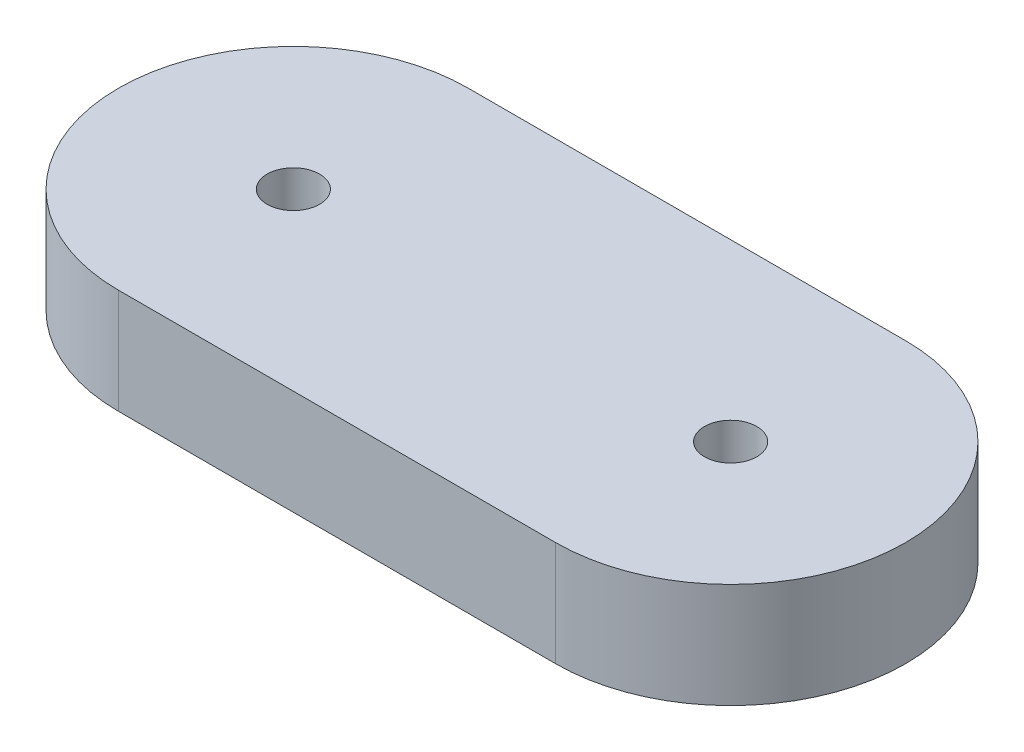
ISO-10303-21;
HEADER;
FILE_DESCRIPTION(('STEP AP214'),'2;1');
FILE_NAME('part.step','',(''),(''),'','','');
FILE_SCHEMA(('AUTOMOTIVE_DESIGN { 1 0 10303 214 1 1 1 1 }'));
ENDSEC;
DATA;
#1=APPLICATION_CONTEXT('core data for automotive mechanical design processes');
#2=APPLICATION_PROTOCOL_DEFINITION('international standard','automotive_design',2000,#1);
#3=PRODUCT_CONTEXT('',#1,'mechanical');
#4=PRODUCT('Part','Part','',(#3));
#5=PRODUCT_RELATED_PRODUCT_CATEGORY('part','',(#4));
#6=PRODUCT_DEFINITION_FORMATION('','',#4);
#7=PRODUCT_DEFINITION_CONTEXT('part definition',#1,'design');
#8=PRODUCT_DEFINITION('design','',#6,#7);
#9=PRODUCT_DEFINITION_SHAPE('','',#8);
#10=(LENGTH_UNIT() NAMED_UNIT(*) SI_UNIT(.MILLI.,.METRE.));
#11=(NAMED_UNIT(*) PLANE_ANGLE_UNIT() SI_UNIT($,.RADIAN.));
#12=(NAMED_UNIT(*) SI_UNIT($,.STERADIAN.) SOLID_ANGLE_UNIT());
#13=UNCERTAINTY_MEASURE_WITH_UNIT(LENGTH_MEASURE(1.E-05),#10,'distance_accuracy_value','');
#14=(GEOMETRIC_REPRESENTATION_CONTEXT(3) GLOBAL_UNCERTAINTY_ASSIGNED_CONTEXT((#13)) GLOBAL_UNIT_ASSIGNED_CONTEXT((#10,
#11,#12)) REPRESENTATION_CONTEXT('',''));
#15=CARTESIAN_POINT('',(0.,0.,0.));
#16=DIRECTION('',(0.,0.,1.));
#17=DIRECTION('',(1.,0.,0.));
#18=AXIS2_PLACEMENT_3D('',#15,#16,#17);
#19=CARTESIAN_POINT('',(-12.5,6.,0.));
#20=DIRECTION('',(0.,1.,0.));
#21=DIRECTION('',(0.,0.,1.));
#22=AXIS2_PLACEMENT_3D('',#19,#20,#21);
#23=PLANE('',#22);
#24=CARTESIAN_POINT('',(-12.5,6.,0.));
#25=DIRECTION('',(0.,1.,0.));
#26=DIRECTION('',(0.,0.,1.));
#27=AXIS2_PLACEMENT_3D('',#24,#25,#26);
#28=CIRCLE('',#27,10.);
#29=CARTESIAN_POINT('',(-12.5,6.,-10.));
#30=VERTEX_POINT('',#29);
#31=CARTESIAN_POINT('',(-12.5,6.,10.));
#32=VERTEX_POINT('',#31);
#33=EDGE_CURVE('E109',#30,#32,#28,.T.);
#34=ORIENTED_EDGE('',*,*,#33,.T.);
#35=DIRECTION('',(1.,0.,0.));
#36=VECTOR('',#35,1.);
#37=CARTESIAN_POINT('',(-12.5,6.,10.));
#38=LINE('',#37,#36);
#39=CARTESIAN_POINT('',(12.5,6.,9.99999999999999));
#40=VERTEX_POINT('',#39);
#41=EDGE_CURVE('E66',#32,#40,#38,.T.);
#42=ORIENTED_EDGE('',*,*,#41,.T.);
#43=CARTESIAN_POINT('',(12.5,6.,0.));
#44=DIRECTION('',(0.,-1.,0.));
#45=DIRECTION('',(0.,0.,1.));
#46=AXIS2_PLACEMENT_3D('',#43,#44,#45);
#47=CIRCLE('',#46,10.);
#48=CARTESIAN_POINT('',(12.5,6.,-10.));
#49=VERTEX_POINT('',#48);
#50=EDGE_CURVE('E88',#49,#40,#47,.T.);
#51=ORIENTED_EDGE('',*,*,#50,.F.);
#52=DIRECTION('',(-1.,0.,0.));
#53=VECTOR('',#52,1.);
#54=CARTESIAN_POINT('',(-12.5,6.,-10.));
#55=LINE('',#54,#53);
#56=EDGE_CURVE('E49',#49,#30,#55,.T.);
#57=ORIENTED_EDGE('',*,*,#56,.T.);
#58=EDGE_LOOP('',(#34,#42,#51,#57));
#59=FACE_BOUND('',#58,.T.);
#60=CARTESIAN_POINT('',(-12.5,6.,0.));
#61=DIRECTION('',(0.,1.,0.));
#62=DIRECTION('',(0.,0.,1.));
#63=AXIS2_PLACEMENT_3D('',#60,#61,#62);
#64=CIRCLE('',#63,1.5);
#65=CARTESIAN_POINT('',(-12.5,6.,1.5));
#66=VERTEX_POINT('',#65);
#67=EDGE_CURVE('E104',#66,#66,#64,.T.);
#68=ORIENTED_EDGE('',*,*,#67,.F.);
#69=EDGE_LOOP('',(#68));
#70=FACE_BOUND('',#69,.T.);
#71=CARTESIAN_POINT('',(12.5,6.,0.));
#72=DIRECTION('',(0.,-1.,0.));
#73=DIRECTION('',(0.,0.,1.));
#74=AXIS2_PLACEMENT_3D('',#71,#72,#73);
#75=CIRCLE('',#74,1.5);
#76=CARTESIAN_POINT('',(12.5,6.,1.5));
#77=VERTEX_POINT('',#76);
#78=EDGE_CURVE('E94',#77,#77,#75,.T.);
#79=ORIENTED_EDGE('',*,*,#78,.T.);
#80=EDGE_LOOP('',(#79));
#81=FACE_BOUND('',#80,.T.);
#82=ADVANCED_FACE('F32',(#59,#70,#81),#23,.T.);
#83=CARTESIAN_POINT('',(-12.5,0.,0.));
#84=DIRECTION('',(0.,1.,0.));
#85=DIRECTION('',(0.,0.,1.));
#86=AXIS2_PLACEMENT_3D('',#83,#84,#85);
#87=PLANE('',#86);
#88=CARTESIAN_POINT('',(-12.5,0.,0.));
#89=DIRECTION('',(0.,1.,0.));
#90=DIRECTION('',(0.,0.,1.));
#91=AXIS2_PLACEMENT_3D('',#88,#89,#90);
#92=CIRCLE('',#91,10.);
#93=CARTESIAN_POINT('',(-12.5,0.,-10.));
#94=VERTEX_POINT('',#93);
#95=CARTESIAN_POINT('',(-12.5,0.,10.));
#96=VERTEX_POINT('',#95);
#97=EDGE_CURVE('E81',#94,#96,#92,.T.);
#98=ORIENTED_EDGE('',*,*,#97,.F.);
#99=DIRECTION('',(-1.,0.,0.));
#100=VECTOR('',#99,1.);
#101=CARTESIAN_POINT('',(-12.5,0.,-10.));
#102=LINE('',#101,#100);
#103=CARTESIAN_POINT('',(12.5,0.,-10.));
#104=VERTEX_POINT('',#103);
#105=EDGE_CURVE('E80',#104,#94,#102,.T.);
#106=ORIENTED_EDGE('',*,*,#105,.F.);
#107=CARTESIAN_POINT('',(12.5,0.,0.));
#108=DIRECTION('',(0.,-1.,0.));
#109=DIRECTION('',(0.,0.,1.));
#110=AXIS2_PLACEMENT_3D('',#107,#108,#109);
#111=CIRCLE('',#110,10.);
#112=CARTESIAN_POINT('',(12.5,0.,9.99999999999999));
#113=VERTEX_POINT('',#112);
#114=EDGE_CURVE('E87',#104,#113,#111,.T.);
#115=ORIENTED_EDGE('',*,*,#114,.T.);
#116=DIRECTION('',(1.,0.,0.));
#117=VECTOR('',#116,1.);
#118=CARTESIAN_POINT('',(-12.5,0.,10.));
#119=LINE('',#118,#117);
#120=EDGE_CURVE('E61',#96,#113,#119,.T.);
#121=ORIENTED_EDGE('',*,*,#120,.F.);
#122=EDGE_LOOP('',(#98,#106,#115,#121));
#123=FACE_BOUND('',#122,.T.);
#124=CARTESIAN_POINT('',(-12.5,0.,0.));
#125=DIRECTION('',(0.,1.,0.));
#126=DIRECTION('',(0.,0.,1.));
#127=AXIS2_PLACEMENT_3D('',#124,#125,#126);
#128=CIRCLE('',#127,1.5);
#129=CARTESIAN_POINT('',(-12.5,0.,1.5));
#130=VERTEX_POINT('',#129);
#131=EDGE_CURVE('E103',#130,#130,#128,.T.);
#132=ORIENTED_EDGE('',*,*,#131,.T.);
#133=EDGE_LOOP('',(#132));
#134=FACE_BOUND('',#133,.T.);
#135=CARTESIAN_POINT('',(12.5,0.,0.));
#136=DIRECTION('',(0.,-1.,0.));
#137=DIRECTION('',(0.,0.,1.));
#138=AXIS2_PLACEMENT_3D('',#135,#136,#137);
#139=CIRCLE('',#138,1.5);
#140=CARTESIAN_POINT('',(12.5,0.,1.5));
#141=VERTEX_POINT('',#140);
#142=EDGE_CURVE('E98',#141,#141,#139,.T.);
#143=ORIENTED_EDGE('',*,*,#142,.F.);
#144=EDGE_LOOP('',(#143));
#145=FACE_BOUND('',#144,.T.);
#146=ADVANCED_FACE('F91',(#123,#134,#145),#87,.F.);
#147=CARTESIAN_POINT('',(-12.5,6.,0.));
#148=DIRECTION('',(0.,-1.,0.));
#149=DIRECTION('',(0.,0.,-1.));
#150=AXIS2_PLACEMENT_3D('',#147,#148,#149);
#151=CYLINDRICAL_SURFACE('',#150,10.);
#152=ORIENTED_EDGE('',*,*,#97,.T.);
#153=DIRECTION('',(0.,-1.,0.));
#154=VECTOR('',#153,1.);
#155=CARTESIAN_POINT('',(-12.5,6.,10.));
#156=LINE('',#155,#154);
#157=EDGE_CURVE('E11',#32,#96,#156,.T.);
#158=ORIENTED_EDGE('',*,*,#157,.F.);
#159=ORIENTED_EDGE('',*,*,#33,.F.);
#160=DIRECTION('',(0.,-1.,0.));
#161=VECTOR('',#160,1.);
#162=CARTESIAN_POINT('',(-12.5,6.,-10.));
#163=LINE('',#162,#161);
#164=EDGE_CURVE('E41',#30,#94,#163,.T.);
#165=ORIENTED_EDGE('',*,*,#164,.T.);
#166=EDGE_LOOP('',(#152,#158,#159,#165));
#167=FACE_BOUND('',#166,.T.);
#168=ADVANCED_FACE('F34',(#167),#151,.T.);
#169=CARTESIAN_POINT('',(-12.5,6.,10.));
#170=DIRECTION('',(0.,0.,-1.));
#171=DIRECTION('',(-1.,0.,0.));
#172=AXIS2_PLACEMENT_3D('',#169,#170,#171);
#173=PLANE('',#172);
#174=ORIENTED_EDGE('',*,*,#120,.T.);
#175=DIRECTION('',(0.,-1.,0.));
#176=VECTOR('',#175,1.);
#177=CARTESIAN_POINT('',(12.5,6.,9.99999999999999));
#178=LINE('',#177,#176);
#179=EDGE_CURVE('E76',#40,#113,#178,.T.);
#180=ORIENTED_EDGE('',*,*,#179,.F.);
#181=ORIENTED_EDGE('',*,*,#41,.F.);
#182=ORIENTED_EDGE('',*,*,#157,.T.);
#183=EDGE_LOOP('',(#174,#180,#181,#182));
#184=FACE_BOUND('',#183,.T.);
#185=ADVANCED_FACE('F75',(#184),#173,.F.);
#186=CARTESIAN_POINT('',(-12.5,6.,-10.));
#187=DIRECTION('',(0.,0.,1.));
#188=DIRECTION('',(1.,0.,0.));
#189=AXIS2_PLACEMENT_3D('',#186,#187,#188);
#190=PLANE('',#189);
#191=ORIENTED_EDGE('',*,*,#105,.T.);
#192=ORIENTED_EDGE('',*,*,#164,.F.);
#193=ORIENTED_EDGE('',*,*,#56,.F.);
#194=DIRECTION('',(0.,-1.,0.));
#195=VECTOR('',#194,1.);
#196=CARTESIAN_POINT('',(12.5,6.,-10.));
#197=LINE('',#196,#195);
#198=EDGE_CURVE('E89',#49,#104,#197,.T.);
#199=ORIENTED_EDGE('',*,*,#198,.T.);
#200=EDGE_LOOP('',(#191,#192,#193,#199));
#201=FACE_BOUND('',#200,.T.);
#202=ADVANCED_FACE('F118',(#201),#190,.F.);
#203=CARTESIAN_POINT('',(-12.5,6.,0.));
#204=DIRECTION('',(0.,-1.,0.));
#205=DIRECTION('',(0.,0.,-1.));
#206=AXIS2_PLACEMENT_3D('',#203,#204,#205);
#207=CYLINDRICAL_SURFACE('',#206,1.5);
#208=ORIENTED_EDGE('',*,*,#67,.T.);
#209=EDGE_LOOP('',(#208));
#210=FACE_BOUND('',#209,.T.);
#211=ORIENTED_EDGE('',*,*,#131,.F.);
#212=EDGE_LOOP('',(#211));
#213=FACE_BOUND('',#212,.T.);
#214=ADVANCED_FACE('F141',(#210,#213),#207,.F.);
#215=CARTESIAN_POINT('',(12.5,6.,0.));
#216=DIRECTION('',(0.,-1.,0.));
#217=DIRECTION('',(0.,0.,-1.));
#218=AXIS2_PLACEMENT_3D('',#215,#216,#217);
#219=CYLINDRICAL_SURFACE('',#218,10.);
#220=ORIENTED_EDGE('',*,*,#114,.F.);
#221=ORIENTED_EDGE('',*,*,#198,.F.);
#222=ORIENTED_EDGE('',*,*,#50,.T.);
#223=ORIENTED_EDGE('',*,*,#179,.T.);
#224=EDGE_LOOP('',(#220,#221,#222,#223));
#225=FACE_BOUND('',#224,.T.);
#226=ADVANCED_FACE('F85',(#225),#219,.T.);
#227=CARTESIAN_POINT('',(12.5,6.,0.));
#228=DIRECTION('',(0.,-1.,0.));
#229=DIRECTION('',(0.,0.,-1.));
#230=AXIS2_PLACEMENT_3D('',#227,#228,#229);
#231=CYLINDRICAL_SURFACE('',#230,1.5);
#232=ORIENTED_EDGE('',*,*,#78,.F.);
#233=EDGE_LOOP('',(#232));
#234=FACE_BOUND('',#233,.T.);
#235=ORIENTED_EDGE('',*,*,#142,.T.);
#236=EDGE_LOOP('',(#235));
#237=FACE_BOUND('',#236,.T.);
#238=ADVANCED_FACE('F126',(#234,#237),#231,.F.);
#239=CLOSED_SHELL('',(#82,#146,#168,#185,#202,#214,#226,#238));
#240=MANIFOLD_SOLID_BREP('B2',#239);
#241=ADVANCED_BREP_SHAPE_REPRESENTATION('',(#18,#240),#14);
#242=SHAPE_DEFINITION_REPRESENTATION(#9,#241);
ENDSEC;
END-ISO-10303-21;
